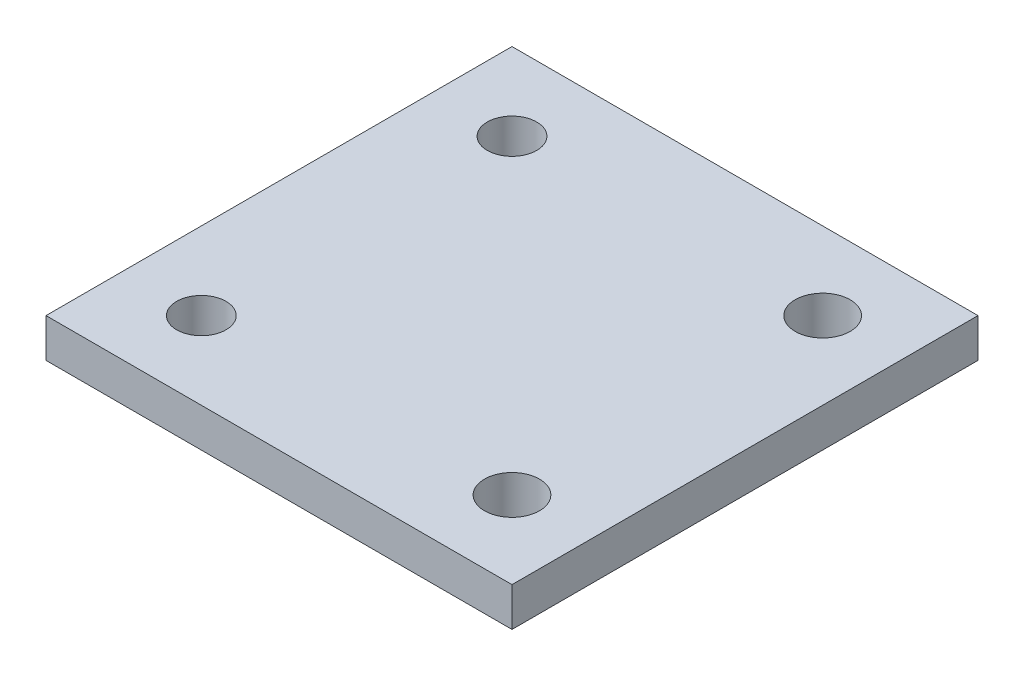
ISO-10303-21;
HEADER;
FILE_DESCRIPTION(('STEP AP214'),'2;1');
FILE_NAME('part.step','',(''),(''),'','','');
FILE_SCHEMA(('AUTOMOTIVE_DESIGN { 1 0 10303 214 1 1 1 1 }'));
ENDSEC;
DATA;
#1=APPLICATION_CONTEXT('core data for automotive mechanical design processes');
#2=APPLICATION_PROTOCOL_DEFINITION('international standard','automotive_design',2000,#1);
#3=PRODUCT_CONTEXT('',#1,'mechanical');
#4=PRODUCT('Part','Part','',(#3));
#5=PRODUCT_RELATED_PRODUCT_CATEGORY('part','',(#4));
#6=PRODUCT_DEFINITION_FORMATION('','',#4);
#7=PRODUCT_DEFINITION_CONTEXT('part definition',#1,'design');
#8=PRODUCT_DEFINITION('design','',#6,#7);
#9=PRODUCT_DEFINITION_SHAPE('','',#8);
#10=(LENGTH_UNIT() NAMED_UNIT(*) SI_UNIT(.MILLI.,.METRE.));
#11=(NAMED_UNIT(*) PLANE_ANGLE_UNIT() SI_UNIT($,.RADIAN.));
#12=(NAMED_UNIT(*) SI_UNIT($,.STERADIAN.) SOLID_ANGLE_UNIT());
#13=UNCERTAINTY_MEASURE_WITH_UNIT(LENGTH_MEASURE(1.E-05),#10,'distance_accuracy_value','');
#14=(GEOMETRIC_REPRESENTATION_CONTEXT(3) GLOBAL_UNCERTAINTY_ASSIGNED_CONTEXT((#13)) GLOBAL_UNIT_ASSIGNED_CONTEXT((#10,
#11,#12)) REPRESENTATION_CONTEXT('',''));
#15=CARTESIAN_POINT('',(0.,0.,0.));
#16=DIRECTION('',(0.,0.,1.));
#17=DIRECTION('',(1.,0.,0.));
#18=AXIS2_PLACEMENT_3D('',#15,#16,#17);
#19=CARTESIAN_POINT('',(19.05,1.5875,19.05));
#20=DIRECTION('',(-1.,0.,0.));
#21=DIRECTION('',(0.,0.,1.));
#22=AXIS2_PLACEMENT_3D('',#19,#20,#21);
#23=PLANE('',#22);
#24=DIRECTION('',(0.,0.,-1.));
#25=VECTOR('',#24,1.);
#26=CARTESIAN_POINT('',(19.05,-1.5875,19.05));
#27=LINE('',#26,#25);
#28=CARTESIAN_POINT('',(19.05,-1.5875,19.05));
#29=VERTEX_POINT('',#28);
#30=CARTESIAN_POINT('',(19.05,-1.5875,-19.05));
#31=VERTEX_POINT('',#30);
#32=EDGE_CURVE('E115',#29,#31,#27,.T.);
#33=ORIENTED_EDGE('',*,*,#32,.T.);
#34=DIRECTION('',(0.,-1.,0.));
#35=VECTOR('',#34,1.);
#36=CARTESIAN_POINT('',(19.05,1.5875,-19.05));
#37=LINE('',#36,#35);
#38=CARTESIAN_POINT('',(19.05,1.5875,-19.05));
#39=VERTEX_POINT('',#38);
#40=EDGE_CURVE('E11',#39,#31,#37,.T.);
#41=ORIENTED_EDGE('',*,*,#40,.F.);
#42=DIRECTION('',(0.,0.,-1.));
#43=VECTOR('',#42,1.);
#44=CARTESIAN_POINT('',(19.05,1.5875,19.05));
#45=LINE('',#44,#43);
#46=CARTESIAN_POINT('',(19.05,1.5875,19.05));
#47=VERTEX_POINT('',#46);
#48=EDGE_CURVE('E97',#47,#39,#45,.T.);
#49=ORIENTED_EDGE('',*,*,#48,.F.);
#50=DIRECTION('',(0.,-1.,0.));
#51=VECTOR('',#50,1.);
#52=CARTESIAN_POINT('',(19.05,1.5875,19.05));
#53=LINE('',#52,#51);
#54=EDGE_CURVE('E111',#47,#29,#53,.T.);
#55=ORIENTED_EDGE('',*,*,#54,.T.);
#56=EDGE_LOOP('',(#33,#41,#49,#55));
#57=FACE_BOUND('',#56,.T.);
#58=ADVANCED_FACE('F45',(#57),#23,.F.);
#59=CARTESIAN_POINT('',(-19.05,1.5875,-19.05));
#60=DIRECTION('',(0.,0.,1.));
#61=DIRECTION('',(1.,0.,0.));
#62=AXIS2_PLACEMENT_3D('',#59,#60,#61);
#63=PLANE('',#62);
#64=DIRECTION('',(-1.,0.,0.));
#65=VECTOR('',#64,1.);
#66=CARTESIAN_POINT('',(-19.05,-1.5875,-19.05));
#67=LINE('',#66,#65);
#68=CARTESIAN_POINT('',(-19.05,-1.5875,-19.05));
#69=VERTEX_POINT('',#68);
#70=EDGE_CURVE('E102',#31,#69,#67,.T.);
#71=ORIENTED_EDGE('',*,*,#70,.T.);
#72=DIRECTION('',(0.,-1.,0.));
#73=VECTOR('',#72,1.);
#74=CARTESIAN_POINT('',(-19.05,1.5875,-19.05));
#75=LINE('',#74,#73);
#76=CARTESIAN_POINT('',(-19.05,1.5875,-19.05));
#77=VERTEX_POINT('',#76);
#78=EDGE_CURVE('E54',#77,#69,#75,.T.);
#79=ORIENTED_EDGE('',*,*,#78,.F.);
#80=DIRECTION('',(-1.,0.,0.));
#81=VECTOR('',#80,1.);
#82=CARTESIAN_POINT('',(-19.05,1.5875,-19.05));
#83=LINE('',#82,#81);
#84=EDGE_CURVE('E92',#39,#77,#83,.T.);
#85=ORIENTED_EDGE('',*,*,#84,.F.);
#86=ORIENTED_EDGE('',*,*,#40,.T.);
#87=EDGE_LOOP('',(#71,#79,#85,#86));
#88=FACE_BOUND('',#87,.T.);
#89=ADVANCED_FACE('F101',(#88),#63,.F.);
#90=CARTESIAN_POINT('',(-19.05,1.5875,19.05));
#91=DIRECTION('',(1.,0.,0.));
#92=DIRECTION('',(0.,0.,-1.));
#93=AXIS2_PLACEMENT_3D('',#90,#91,#92);
#94=PLANE('',#93);
#95=DIRECTION('',(0.,0.,1.));
#96=VECTOR('',#95,1.);
#97=CARTESIAN_POINT('',(-19.05,-1.5875,19.05));
#98=LINE('',#97,#96);
#99=CARTESIAN_POINT('',(-19.05,-1.5875,19.05));
#100=VERTEX_POINT('',#99);
#101=EDGE_CURVE('E79',#69,#100,#98,.T.);
#102=ORIENTED_EDGE('',*,*,#101,.T.);
#103=DIRECTION('',(0.,-1.,0.));
#104=VECTOR('',#103,1.);
#105=CARTESIAN_POINT('',(-19.05,1.5875,19.05));
#106=LINE('',#105,#104);
#107=CARTESIAN_POINT('',(-19.05,1.5875,19.05));
#108=VERTEX_POINT('',#107);
#109=EDGE_CURVE('E104',#108,#100,#106,.T.);
#110=ORIENTED_EDGE('',*,*,#109,.F.);
#111=DIRECTION('',(0.,0.,1.));
#112=VECTOR('',#111,1.);
#113=CARTESIAN_POINT('',(-19.05,1.5875,19.05));
#114=LINE('',#113,#112);
#115=EDGE_CURVE('E95',#77,#108,#114,.T.);
#116=ORIENTED_EDGE('',*,*,#115,.F.);
#117=ORIENTED_EDGE('',*,*,#78,.T.);
#118=EDGE_LOOP('',(#102,#110,#116,#117));
#119=FACE_BOUND('',#118,.T.);
#120=ADVANCED_FACE('F105',(#119),#94,.F.);
#121=CARTESIAN_POINT('',(-19.05,1.5875,19.05));
#122=DIRECTION('',(0.,0.,-1.));
#123=DIRECTION('',(-1.,0.,0.));
#124=AXIS2_PLACEMENT_3D('',#121,#122,#123);
#125=PLANE('',#124);
#126=DIRECTION('',(1.,0.,0.));
#127=VECTOR('',#126,1.);
#128=CARTESIAN_POINT('',(-19.05,-1.5875,19.05));
#129=LINE('',#128,#127);
#130=EDGE_CURVE('E85',#100,#29,#129,.T.);
#131=ORIENTED_EDGE('',*,*,#130,.T.);
#132=ORIENTED_EDGE('',*,*,#54,.F.);
#133=DIRECTION('',(1.,0.,0.));
#134=VECTOR('',#133,1.);
#135=CARTESIAN_POINT('',(-19.05,1.5875,19.05));
#136=LINE('',#135,#134);
#137=EDGE_CURVE('E62',#108,#47,#136,.T.);
#138=ORIENTED_EDGE('',*,*,#137,.F.);
#139=ORIENTED_EDGE('',*,*,#109,.T.);
#140=EDGE_LOOP('',(#131,#132,#138,#139));
#141=FACE_BOUND('',#140,.T.);
#142=ADVANCED_FACE('F131',(#141),#125,.F.);
#143=CARTESIAN_POINT('',(0.,1.5875,0.));
#144=DIRECTION('',(0.,-1.,0.));
#145=DIRECTION('',(0.,0.,-1.));
#146=AXIS2_PLACEMENT_3D('',#143,#144,#145);
#147=PLANE('',#146);
#148=CARTESIAN_POINT('',(12.7,1.5875,-12.7));
#149=DIRECTION('',(0.,1.,0.));
#150=DIRECTION('',(0.,0.,1.));
#151=AXIS2_PLACEMENT_3D('',#148,#149,#150);
#152=CIRCLE('',#151,2.24789999999999);
#153=CARTESIAN_POINT('',(12.7,1.5875,-10.4521));
#154=VERTEX_POINT('',#153);
#155=EDGE_CURVE('E167',#154,#154,#152,.T.);
#156=ORIENTED_EDGE('',*,*,#155,.F.);
#157=EDGE_LOOP('',(#156));
#158=FACE_BOUND('',#157,.T.);
#159=CARTESIAN_POINT('',(12.7,1.5875,12.7));
#160=DIRECTION('',(0.,1.,0.));
#161=DIRECTION('',(0.,0.,1.));
#162=AXIS2_PLACEMENT_3D('',#159,#160,#161);
#163=CIRCLE('',#162,2.24789999999999);
#164=CARTESIAN_POINT('',(12.7,1.5875,14.9479));
#165=VERTEX_POINT('',#164);
#166=EDGE_CURVE('E159',#165,#165,#163,.T.);
#167=ORIENTED_EDGE('',*,*,#166,.F.);
#168=EDGE_LOOP('',(#167));
#169=FACE_BOUND('',#168,.T.);
#170=CARTESIAN_POINT('',(-12.7,1.5875,-12.7));
#171=DIRECTION('',(0.,1.,0.));
#172=DIRECTION('',(0.,0.,1.));
#173=AXIS2_PLACEMENT_3D('',#170,#171,#172);
#174=CIRCLE('',#173,2.01929999999999);
#175=CARTESIAN_POINT('',(-12.7,1.5875,-10.6807));
#176=VERTEX_POINT('',#175);
#177=EDGE_CURVE('E151',#176,#176,#174,.T.);
#178=ORIENTED_EDGE('',*,*,#177,.F.);
#179=EDGE_LOOP('',(#178));
#180=FACE_BOUND('',#179,.T.);
#181=CARTESIAN_POINT('',(-12.7,1.5875,12.7));
#182=DIRECTION('',(0.,1.,0.));
#183=DIRECTION('',(0.,0.,1.));
#184=AXIS2_PLACEMENT_3D('',#181,#182,#183);
#185=CIRCLE('',#184,2.01929999999999);
#186=CARTESIAN_POINT('',(-12.7,1.5875,14.7193));
#187=VERTEX_POINT('',#186);
#188=EDGE_CURVE('E143',#187,#187,#185,.T.);
#189=ORIENTED_EDGE('',*,*,#188,.F.);
#190=EDGE_LOOP('',(#189));
#191=FACE_BOUND('',#190,.T.);
#192=ORIENTED_EDGE('',*,*,#48,.T.);
#193=ORIENTED_EDGE('',*,*,#84,.T.);
#194=ORIENTED_EDGE('',*,*,#115,.T.);
#195=ORIENTED_EDGE('',*,*,#137,.T.);
#196=EDGE_LOOP('',(#192,#193,#194,#195));
#197=FACE_BOUND('',#196,.T.);
#198=ADVANCED_FACE('F93',(#158,#169,#180,#191,#197),#147,.F.);
#199=CARTESIAN_POINT('',(0.,-1.5875,0.));
#200=DIRECTION('',(0.,-1.,0.));
#201=DIRECTION('',(0.,0.,-1.));
#202=AXIS2_PLACEMENT_3D('',#199,#200,#201);
#203=PLANE('',#202);
#204=CARTESIAN_POINT('',(12.7,-1.5875,-12.7));
#205=DIRECTION('',(0.,1.,0.));
#206=DIRECTION('',(0.,0.,1.));
#207=AXIS2_PLACEMENT_3D('',#204,#205,#206);
#208=CIRCLE('',#207,2.2479);
#209=CARTESIAN_POINT('',(12.7,-1.5875,-10.4521));
#210=VERTEX_POINT('',#209);
#211=EDGE_CURVE('E163',#210,#210,#208,.T.);
#212=ORIENTED_EDGE('',*,*,#211,.T.);
#213=EDGE_LOOP('',(#212));
#214=FACE_BOUND('',#213,.T.);
#215=CARTESIAN_POINT('',(12.7,-1.5875,12.7));
#216=DIRECTION('',(0.,1.,0.));
#217=DIRECTION('',(0.,0.,1.));
#218=AXIS2_PLACEMENT_3D('',#215,#216,#217);
#219=CIRCLE('',#218,2.2479);
#220=CARTESIAN_POINT('',(12.7,-1.5875,14.9479));
#221=VERTEX_POINT('',#220);
#222=EDGE_CURVE('E155',#221,#221,#219,.T.);
#223=ORIENTED_EDGE('',*,*,#222,.T.);
#224=EDGE_LOOP('',(#223));
#225=FACE_BOUND('',#224,.T.);
#226=CARTESIAN_POINT('',(-12.7,-1.5875,-12.7));
#227=DIRECTION('',(0.,1.,0.));
#228=DIRECTION('',(0.,0.,1.));
#229=AXIS2_PLACEMENT_3D('',#226,#227,#228);
#230=CIRCLE('',#229,2.0193);
#231=CARTESIAN_POINT('',(-12.7,-1.5875,-10.6807));
#232=VERTEX_POINT('',#231);
#233=EDGE_CURVE('E147',#232,#232,#230,.T.);
#234=ORIENTED_EDGE('',*,*,#233,.T.);
#235=EDGE_LOOP('',(#234));
#236=FACE_BOUND('',#235,.T.);
#237=CARTESIAN_POINT('',(-12.7,-1.5875,12.7));
#238=DIRECTION('',(0.,1.,0.));
#239=DIRECTION('',(0.,0.,1.));
#240=AXIS2_PLACEMENT_3D('',#237,#238,#239);
#241=CIRCLE('',#240,2.0193);
#242=CARTESIAN_POINT('',(-12.7,-1.5875,14.7193));
#243=VERTEX_POINT('',#242);
#244=EDGE_CURVE('E119',#243,#243,#241,.T.);
#245=ORIENTED_EDGE('',*,*,#244,.T.);
#246=EDGE_LOOP('',(#245));
#247=FACE_BOUND('',#246,.T.);
#248=ORIENTED_EDGE('',*,*,#32,.F.);
#249=ORIENTED_EDGE('',*,*,#130,.F.);
#250=ORIENTED_EDGE('',*,*,#101,.F.);
#251=ORIENTED_EDGE('',*,*,#70,.F.);
#252=EDGE_LOOP('',(#248,#249,#250,#251));
#253=FACE_BOUND('',#252,.T.);
#254=ADVANCED_FACE('F134',(#214,#225,#236,#247,#253),#203,.T.);
#255=CARTESIAN_POINT('',(-12.7,1.5875,12.7));
#256=DIRECTION('',(0.,1.,0.));
#257=DIRECTION('',(0.,0.,1.));
#258=AXIS2_PLACEMENT_3D('',#255,#256,#257);
#259=CYLINDRICAL_SURFACE('',#258,2.01929999999999);
#260=ORIENTED_EDGE('',*,*,#244,.F.);
#261=EDGE_LOOP('',(#260));
#262=FACE_BOUND('',#261,.T.);
#263=ORIENTED_EDGE('',*,*,#188,.T.);
#264=EDGE_LOOP('',(#263));
#265=FACE_BOUND('',#264,.T.);
#266=ADVANCED_FACE('F185',(#262,#265),#259,.F.);
#267=CARTESIAN_POINT('',(-12.7,1.5875,-12.7));
#268=DIRECTION('',(0.,1.,0.));
#269=DIRECTION('',(0.,0.,1.));
#270=AXIS2_PLACEMENT_3D('',#267,#268,#269);
#271=CYLINDRICAL_SURFACE('',#270,2.01929999999999);
#272=ORIENTED_EDGE('',*,*,#233,.F.);
#273=EDGE_LOOP('',(#272));
#274=FACE_BOUND('',#273,.T.);
#275=ORIENTED_EDGE('',*,*,#177,.T.);
#276=EDGE_LOOP('',(#275));
#277=FACE_BOUND('',#276,.T.);
#278=ADVANCED_FACE('F187',(#274,#277),#271,.F.);
#279=CARTESIAN_POINT('',(12.7,1.5875,12.7));
#280=DIRECTION('',(0.,1.,0.));
#281=DIRECTION('',(0.,0.,1.));
#282=AXIS2_PLACEMENT_3D('',#279,#280,#281);
#283=CYLINDRICAL_SURFACE('',#282,2.24789999999999);
#284=ORIENTED_EDGE('',*,*,#222,.F.);
#285=EDGE_LOOP('',(#284));
#286=FACE_BOUND('',#285,.T.);
#287=ORIENTED_EDGE('',*,*,#166,.T.);
#288=EDGE_LOOP('',(#287));
#289=FACE_BOUND('',#288,.T.);
#290=ADVANCED_FACE('F194',(#286,#289),#283,.F.);
#291=CARTESIAN_POINT('',(12.7,1.5875,-12.7));
#292=DIRECTION('',(0.,1.,0.));
#293=DIRECTION('',(0.,0.,1.));
#294=AXIS2_PLACEMENT_3D('',#291,#292,#293);
#295=CYLINDRICAL_SURFACE('',#294,2.24789999999999);
#296=ORIENTED_EDGE('',*,*,#211,.F.);
#297=EDGE_LOOP('',(#296));
#298=FACE_BOUND('',#297,.T.);
#299=ORIENTED_EDGE('',*,*,#155,.T.);
#300=EDGE_LOOP('',(#299));
#301=FACE_BOUND('',#300,.T.);
#302=ADVANCED_FACE('F174',(#298,#301),#295,.F.);
#303=CLOSED_SHELL('',(#58,#89,#120,#142,#198,#254,#266,#278,#290,#302));
#304=MANIFOLD_SOLID_BREP('B2',#303);
#305=ADVANCED_BREP_SHAPE_REPRESENTATION('',(#18,#304),#14);
#306=SHAPE_DEFINITION_REPRESENTATION(#9,#305);
ENDSEC;
END-ISO-10303-21;
